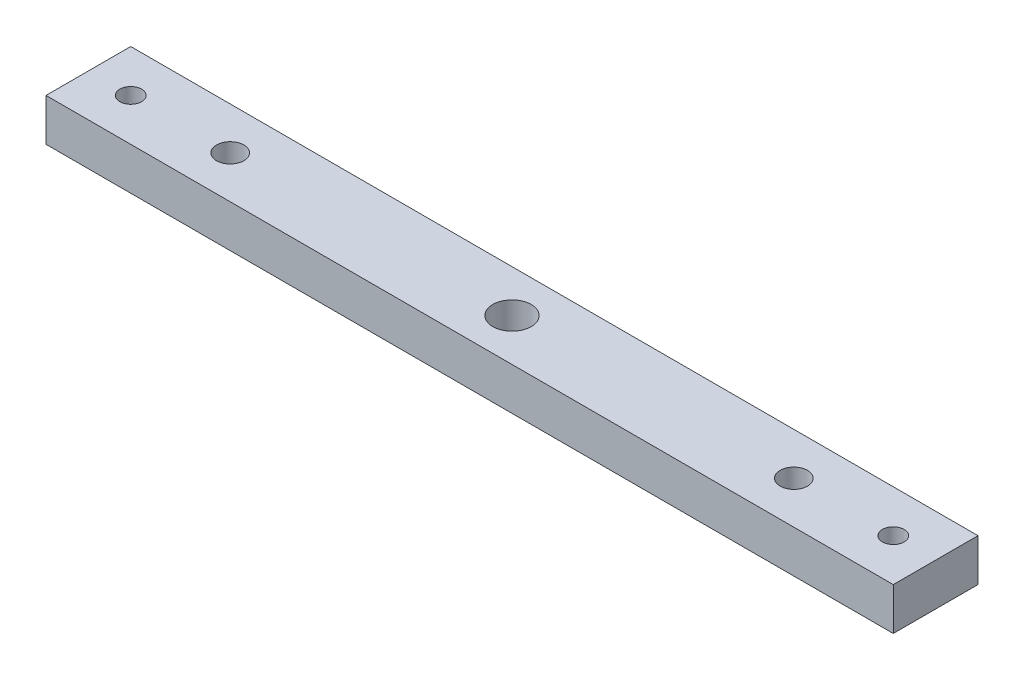
ISO-10303-21;
HEADER;
FILE_DESCRIPTION(('STEP AP214'),'2;1');
FILE_NAME('part.step','',(''),(''),'','','');
FILE_SCHEMA(('AUTOMOTIVE_DESIGN { 1 0 10303 214 1 1 1 1 }'));
ENDSEC;
DATA;
#1=APPLICATION_CONTEXT('core data for automotive mechanical design processes');
#2=APPLICATION_PROTOCOL_DEFINITION('international standard','automotive_design',2000,#1);
#3=PRODUCT_CONTEXT('',#1,'mechanical');
#4=PRODUCT('Part','Part','',(#3));
#5=PRODUCT_RELATED_PRODUCT_CATEGORY('part','',(#4));
#6=PRODUCT_DEFINITION_FORMATION('','',#4);
#7=PRODUCT_DEFINITION_CONTEXT('part definition',#1,'design');
#8=PRODUCT_DEFINITION('design','',#6,#7);
#9=PRODUCT_DEFINITION_SHAPE('','',#8);
#10=(LENGTH_UNIT() NAMED_UNIT(*) SI_UNIT(.MILLI.,.METRE.));
#11=(NAMED_UNIT(*) PLANE_ANGLE_UNIT() SI_UNIT($,.RADIAN.));
#12=(NAMED_UNIT(*) SI_UNIT($,.STERADIAN.) SOLID_ANGLE_UNIT());
#13=UNCERTAINTY_MEASURE_WITH_UNIT(LENGTH_MEASURE(1.E-05),#10,'distance_accuracy_value','');
#14=(GEOMETRIC_REPRESENTATION_CONTEXT(3) GLOBAL_UNCERTAINTY_ASSIGNED_CONTEXT((#13)) GLOBAL_UNIT_ASSIGNED_CONTEXT((#10,
#11,#12)) REPRESENTATION_CONTEXT('',''));
#15=CARTESIAN_POINT('',(0.,0.,0.));
#16=DIRECTION('',(0.,0.,1.));
#17=DIRECTION('',(1.,0.,0.));
#18=AXIS2_PLACEMENT_3D('',#15,#16,#17);
#19=CARTESIAN_POINT('',(0.,12.7,0.));
#20=DIRECTION('',(-1.,0.,0.));
#21=DIRECTION('',(0.,0.,1.));
#22=AXIS2_PLACEMENT_3D('',#19,#20,#21);
#23=PLANE('',#22);
#24=DIRECTION('',(0.,0.,-1.));
#25=VECTOR('',#24,1.);
#26=CARTESIAN_POINT('',(0.,0.,0.));
#27=LINE('',#26,#25);
#28=CARTESIAN_POINT('',(0.,0.,0.));
#29=VERTEX_POINT('',#28);
#30=CARTESIAN_POINT('',(0.,0.,-25.4));
#31=VERTEX_POINT('',#30);
#32=EDGE_CURVE('E103',#29,#31,#27,.T.);
#33=ORIENTED_EDGE('',*,*,#32,.T.);
#34=DIRECTION('',(0.,-1.,0.));
#35=VECTOR('',#34,1.);
#36=CARTESIAN_POINT('',(0.,12.7,-25.4));
#37=LINE('',#36,#35);
#38=CARTESIAN_POINT('',(0.,12.7,-25.4));
#39=VERTEX_POINT('',#38);
#40=EDGE_CURVE('E12',#39,#31,#37,.T.);
#41=ORIENTED_EDGE('',*,*,#40,.F.);
#42=DIRECTION('',(0.,0.,-1.));
#43=VECTOR('',#42,1.);
#44=CARTESIAN_POINT('',(0.,12.7,0.));
#45=LINE('',#44,#43);
#46=CARTESIAN_POINT('',(0.,12.7,0.));
#47=VERTEX_POINT('',#46);
#48=EDGE_CURVE('E91',#47,#39,#45,.T.);
#49=ORIENTED_EDGE('',*,*,#48,.F.);
#50=DIRECTION('',(0.,-1.,0.));
#51=VECTOR('',#50,1.);
#52=CARTESIAN_POINT('',(0.,12.7,0.));
#53=LINE('',#52,#51);
#54=EDGE_CURVE('E99',#47,#29,#53,.T.);
#55=ORIENTED_EDGE('',*,*,#54,.T.);
#56=EDGE_LOOP('',(#33,#41,#49,#55));
#57=FACE_BOUND('',#56,.T.);
#58=ADVANCED_FACE('F39',(#57),#23,.F.);
#59=CARTESIAN_POINT('',(0.,12.7,-25.4));
#60=DIRECTION('',(0.,0.,1.));
#61=DIRECTION('',(1.,0.,0.));
#62=AXIS2_PLACEMENT_3D('',#59,#60,#61);
#63=PLANE('',#62);
#64=DIRECTION('',(-1.,0.,0.));
#65=VECTOR('',#64,1.);
#66=CARTESIAN_POINT('',(0.,0.,-25.4));
#67=LINE('',#66,#65);
#68=CARTESIAN_POINT('',(-254.,0.,-25.4));
#69=VERTEX_POINT('',#68);
#70=EDGE_CURVE('E95',#31,#69,#67,.T.);
#71=ORIENTED_EDGE('',*,*,#70,.T.);
#72=DIRECTION('',(0.,-1.,0.));
#73=VECTOR('',#72,1.);
#74=CARTESIAN_POINT('',(-254.,12.7,-25.4));
#75=LINE('',#74,#73);
#76=CARTESIAN_POINT('',(-254.,12.7,-25.4));
#77=VERTEX_POINT('',#76);
#78=EDGE_CURVE('E48',#77,#69,#75,.T.);
#79=ORIENTED_EDGE('',*,*,#78,.F.);
#80=DIRECTION('',(-1.,0.,0.));
#81=VECTOR('',#80,1.);
#82=CARTESIAN_POINT('',(0.,12.7,-25.4));
#83=LINE('',#82,#81);
#84=EDGE_CURVE('E86',#39,#77,#83,.T.);
#85=ORIENTED_EDGE('',*,*,#84,.F.);
#86=ORIENTED_EDGE('',*,*,#40,.T.);
#87=EDGE_LOOP('',(#71,#79,#85,#86));
#88=FACE_BOUND('',#87,.T.);
#89=ADVANCED_FACE('F94',(#88),#63,.F.);
#90=CARTESIAN_POINT('',(-254.,12.7,0.));
#91=DIRECTION('',(1.,0.,0.));
#92=DIRECTION('',(0.,0.,-1.));
#93=AXIS2_PLACEMENT_3D('',#90,#91,#92);
#94=PLANE('',#93);
#95=DIRECTION('',(0.,0.,1.));
#96=VECTOR('',#95,1.);
#97=CARTESIAN_POINT('',(-254.,0.,0.));
#98=LINE('',#97,#96);
#99=CARTESIAN_POINT('',(-254.,0.,0.));
#100=VERTEX_POINT('',#99);
#101=EDGE_CURVE('E73',#69,#100,#98,.T.);
#102=ORIENTED_EDGE('',*,*,#101,.T.);
#103=DIRECTION('',(0.,-1.,0.));
#104=VECTOR('',#103,1.);
#105=CARTESIAN_POINT('',(-254.,12.7,0.));
#106=LINE('',#105,#104);
#107=CARTESIAN_POINT('',(-254.,12.7,0.));
#108=VERTEX_POINT('',#107);
#109=EDGE_CURVE('E96',#108,#100,#106,.T.);
#110=ORIENTED_EDGE('',*,*,#109,.F.);
#111=DIRECTION('',(0.,0.,1.));
#112=VECTOR('',#111,1.);
#113=CARTESIAN_POINT('',(-254.,12.7,0.));
#114=LINE('',#113,#112);
#115=EDGE_CURVE('E89',#77,#108,#114,.T.);
#116=ORIENTED_EDGE('',*,*,#115,.F.);
#117=ORIENTED_EDGE('',*,*,#78,.T.);
#118=EDGE_LOOP('',(#102,#110,#116,#117));
#119=FACE_BOUND('',#118,.T.);
#120=ADVANCED_FACE('F97',(#119),#94,.F.);
#121=CARTESIAN_POINT('',(0.,12.7,0.));
#122=DIRECTION('',(0.,0.,-1.));
#123=DIRECTION('',(-1.,0.,0.));
#124=AXIS2_PLACEMENT_3D('',#121,#122,#123);
#125=PLANE('',#124);
#126=DIRECTION('',(1.,0.,0.));
#127=VECTOR('',#126,1.);
#128=CARTESIAN_POINT('',(0.,0.,0.));
#129=LINE('',#128,#127);
#130=EDGE_CURVE('E79',#100,#29,#129,.T.);
#131=ORIENTED_EDGE('',*,*,#130,.T.);
#132=ORIENTED_EDGE('',*,*,#54,.F.);
#133=DIRECTION('',(1.,0.,0.));
#134=VECTOR('',#133,1.);
#135=CARTESIAN_POINT('',(0.,12.7,0.));
#136=LINE('',#135,#134);
#137=EDGE_CURVE('E56',#108,#47,#136,.T.);
#138=ORIENTED_EDGE('',*,*,#137,.F.);
#139=ORIENTED_EDGE('',*,*,#109,.T.);
#140=EDGE_LOOP('',(#131,#132,#138,#139));
#141=FACE_BOUND('',#140,.T.);
#142=ADVANCED_FACE('F122',(#141),#125,.F.);
#143=CARTESIAN_POINT('',(0.,12.7,0.));
#144=DIRECTION('',(0.,1.,0.));
#145=DIRECTION('',(0.,0.,1.));
#146=AXIS2_PLACEMENT_3D('',#143,#144,#145);
#147=PLANE('',#146);
#148=CARTESIAN_POINT('',(-127.,12.7,-12.7));
#149=DIRECTION('',(0.,1.,0.));
#150=DIRECTION('',(0.,0.,1.));
#151=AXIS2_PLACEMENT_3D('',#148,#149,#150);
#152=CIRCLE('',#151,5.75436999999998);
#153=CARTESIAN_POINT('',(-127.,12.7,-6.94563000000002));
#154=VERTEX_POINT('',#153);
#155=EDGE_CURVE('E168',#154,#154,#152,.T.);
#156=ORIENTED_EDGE('',*,*,#155,.F.);
#157=EDGE_LOOP('',(#156));
#158=FACE_BOUND('',#157,.T.);
#159=CARTESIAN_POINT('',(-241.3,12.7,-12.7));
#160=DIRECTION('',(0.,-1.,0.));
#161=DIRECTION('',(0.,0.,-1.));
#162=AXIS2_PLACEMENT_3D('',#159,#160,#161);
#163=CIRCLE('',#162,3.26389999999999);
#164=CARTESIAN_POINT('',(-241.3,12.7,-15.9639));
#165=VERTEX_POINT('',#164);
#166=EDGE_CURVE('E154',#165,#165,#163,.T.);
#167=ORIENTED_EDGE('',*,*,#166,.T.);
#168=EDGE_LOOP('',(#167));
#169=FACE_BOUND('',#168,.T.);
#170=CARTESIAN_POINT('',(-12.7,12.7,-12.7));
#171=DIRECTION('',(0.,-1.,0.));
#172=DIRECTION('',(0.,0.,-1.));
#173=AXIS2_PLACEMENT_3D('',#170,#171,#172);
#174=CIRCLE('',#173,3.2639);
#175=CARTESIAN_POINT('',(-12.7,12.7,-15.9639));
#176=VERTEX_POINT('',#175);
#177=EDGE_CURVE('E140',#176,#176,#174,.T.);
#178=ORIENTED_EDGE('',*,*,#177,.T.);
#179=EDGE_LOOP('',(#178));
#180=FACE_BOUND('',#179,.T.);
#181=CARTESIAN_POINT('',(-42.5196,12.7,-12.7));
#182=DIRECTION('',(0.,-1.,0.));
#183=DIRECTION('',(0.,0.,-1.));
#184=AXIS2_PLACEMENT_3D('',#181,#182,#183);
#185=CIRCLE('',#184,4.1021);
#186=CARTESIAN_POINT('',(-42.5196,12.7,-16.8021));
#187=VERTEX_POINT('',#186);
#188=EDGE_CURVE('E132',#187,#187,#185,.T.);
#189=ORIENTED_EDGE('',*,*,#188,.T.);
#190=EDGE_LOOP('',(#189));
#191=FACE_BOUND('',#190,.T.);
#192=CARTESIAN_POINT('',(-211.4804,12.7,-12.7));
#193=DIRECTION('',(0.,-1.,0.));
#194=DIRECTION('',(0.,0.,-1.));
#195=AXIS2_PLACEMENT_3D('',#192,#193,#194);
#196=CIRCLE('',#195,4.10209999999999);
#197=CARTESIAN_POINT('',(-211.4804,12.7,-16.8021));
#198=VERTEX_POINT('',#197);
#199=EDGE_CURVE('E108',#198,#198,#196,.T.);
#200=ORIENTED_EDGE('',*,*,#199,.T.);
#201=EDGE_LOOP('',(#200));
#202=FACE_BOUND('',#201,.T.);
#203=ORIENTED_EDGE('',*,*,#48,.T.);
#204=ORIENTED_EDGE('',*,*,#84,.T.);
#205=ORIENTED_EDGE('',*,*,#115,.T.);
#206=ORIENTED_EDGE('',*,*,#137,.T.);
#207=EDGE_LOOP('',(#203,#204,#205,#206));
#208=FACE_BOUND('',#207,.T.);
#209=ADVANCED_FACE('F87',(#158,#169,#180,#191,#202,#208),#147,.T.);
#210=CARTESIAN_POINT('',(0.,0.,0.));
#211=DIRECTION('',(0.,1.,0.));
#212=DIRECTION('',(0.,0.,1.));
#213=AXIS2_PLACEMENT_3D('',#210,#211,#212);
#214=PLANE('',#213);
#215=CARTESIAN_POINT('',(-127.,0.,-12.7));
#216=DIRECTION('',(0.,1.,0.));
#217=DIRECTION('',(0.,0.,1.));
#218=AXIS2_PLACEMENT_3D('',#215,#216,#217);
#219=CIRCLE('',#218,5.75436999999999);
#220=CARTESIAN_POINT('',(-127.,0.,-6.94563));
#221=VERTEX_POINT('',#220);
#222=EDGE_CURVE('E164',#221,#221,#219,.T.);
#223=ORIENTED_EDGE('',*,*,#222,.T.);
#224=EDGE_LOOP('',(#223));
#225=FACE_BOUND('',#224,.T.);
#226=CARTESIAN_POINT('',(-241.3,0.,-12.7));
#227=DIRECTION('',(0.,-1.,0.));
#228=DIRECTION('',(0.,0.,-1.));
#229=AXIS2_PLACEMENT_3D('',#226,#227,#228);
#230=CIRCLE('',#229,6.4389);
#231=CARTESIAN_POINT('',(-241.3,0.,-19.1389));
#232=VERTEX_POINT('',#231);
#233=EDGE_CURVE('E161',#232,#232,#230,.T.);
#234=ORIENTED_EDGE('',*,*,#233,.F.);
#235=EDGE_LOOP('',(#234));
#236=FACE_BOUND('',#235,.T.);
#237=CARTESIAN_POINT('',(-12.7,0.,-12.7));
#238=DIRECTION('',(0.,-1.,0.));
#239=DIRECTION('',(0.,0.,-1.));
#240=AXIS2_PLACEMENT_3D('',#237,#238,#239);
#241=CIRCLE('',#240,6.4389);
#242=CARTESIAN_POINT('',(-12.7,0.,-19.1389));
#243=VERTEX_POINT('',#242);
#244=EDGE_CURVE('E151',#243,#243,#241,.T.);
#245=ORIENTED_EDGE('',*,*,#244,.F.);
#246=EDGE_LOOP('',(#245));
#247=FACE_BOUND('',#246,.T.);
#248=CARTESIAN_POINT('',(-42.5196,0.,-12.7));
#249=DIRECTION('',(0.,-1.,0.));
#250=DIRECTION('',(0.,0.,-1.));
#251=AXIS2_PLACEMENT_3D('',#248,#249,#250);
#252=CIRCLE('',#251,4.1021);
#253=CARTESIAN_POINT('',(-42.5196,0.,-16.8021));
#254=VERTEX_POINT('',#253);
#255=EDGE_CURVE('E136',#254,#254,#252,.T.);
#256=ORIENTED_EDGE('',*,*,#255,.F.);
#257=EDGE_LOOP('',(#256));
#258=FACE_BOUND('',#257,.T.);
#259=CARTESIAN_POINT('',(-211.4804,0.,-12.7));
#260=DIRECTION('',(0.,-1.,0.));
#261=DIRECTION('',(0.,0.,-1.));
#262=AXIS2_PLACEMENT_3D('',#259,#260,#261);
#263=CIRCLE('',#262,4.10209999999999);
#264=CARTESIAN_POINT('',(-211.4804,0.,-16.8021));
#265=VERTEX_POINT('',#264);
#266=EDGE_CURVE('E128',#265,#265,#263,.T.);
#267=ORIENTED_EDGE('',*,*,#266,.F.);
#268=EDGE_LOOP('',(#267));
#269=FACE_BOUND('',#268,.T.);
#270=ORIENTED_EDGE('',*,*,#32,.F.);
#271=ORIENTED_EDGE('',*,*,#130,.F.);
#272=ORIENTED_EDGE('',*,*,#101,.F.);
#273=ORIENTED_EDGE('',*,*,#70,.F.);
#274=EDGE_LOOP('',(#270,#271,#272,#273));
#275=FACE_BOUND('',#274,.T.);
#276=ADVANCED_FACE('F125',(#225,#236,#247,#258,#269,#275),#214,.F.);
#277=CARTESIAN_POINT('',(-211.4804,12.7,-12.7));
#278=DIRECTION('',(0.,-1.,0.));
#279=DIRECTION('',(0.,0.,-1.));
#280=AXIS2_PLACEMENT_3D('',#277,#278,#279);
#281=CYLINDRICAL_SURFACE('',#280,4.10209999999999);
#282=ORIENTED_EDGE('',*,*,#199,.F.);
#283=EDGE_LOOP('',(#282));
#284=FACE_BOUND('',#283,.T.);
#285=ORIENTED_EDGE('',*,*,#266,.T.);
#286=EDGE_LOOP('',(#285));
#287=FACE_BOUND('',#286,.T.);
#288=ADVANCED_FACE('F207',(#284,#287),#281,.F.);
#289=CARTESIAN_POINT('',(-42.5196,12.7,-12.7));
#290=DIRECTION('',(0.,-1.,0.));
#291=DIRECTION('',(0.,0.,-1.));
#292=AXIS2_PLACEMENT_3D('',#289,#290,#291);
#293=CYLINDRICAL_SURFACE('',#292,4.1021);
#294=ORIENTED_EDGE('',*,*,#188,.F.);
#295=EDGE_LOOP('',(#294));
#296=FACE_BOUND('',#295,.T.);
#297=ORIENTED_EDGE('',*,*,#255,.T.);
#298=EDGE_LOOP('',(#297));
#299=FACE_BOUND('',#298,.T.);
#300=ADVANCED_FACE('F212',(#296,#299),#293,.F.);
#301=CARTESIAN_POINT('',(-12.7,0.,-12.7));
#302=DIRECTION('',(0.,-1.,0.));
#303=DIRECTION('',(0.,0.,-1.));
#304=AXIS2_PLACEMENT_3D('',#301,#302,#303);
#305=CYLINDRICAL_SURFACE('',#304,3.2639);
#306=ORIENTED_EDGE('',*,*,#177,.F.);
#307=EDGE_LOOP('',(#306));
#308=FACE_BOUND('',#307,.T.);
#309=CARTESIAN_POINT('',(-12.7,3.6524196929267,-12.7));
#310=DIRECTION('',(0.,-1.,0.));
#311=DIRECTION('',(0.,0.,-1.));
#312=AXIS2_PLACEMENT_3D('',#309,#310,#311);
#313=CIRCLE('',#312,3.2639);
#314=CARTESIAN_POINT('',(-12.7,3.6524196929267,-15.9639));
#315=VERTEX_POINT('',#314);
#316=EDGE_CURVE('E147',#315,#315,#313,.T.);
#317=ORIENTED_EDGE('',*,*,#316,.T.);
#318=EDGE_LOOP('',(#317));
#319=FACE_BOUND('',#318,.T.);
#320=ADVANCED_FACE('F271',(#308,#319),#305,.F.);
#321=CARTESIAN_POINT('',(-12.7,0.,-12.7));
#322=DIRECTION('',(0.,-1.,0.));
#323=DIRECTION('',(0.,0.,-1.));
#324=AXIS2_PLACEMENT_3D('',#321,#322,#323);
#325=CONICAL_SURFACE('',#324,6.4389,0.715584993317676);
#326=ORIENTED_EDGE('',*,*,#316,.F.);
#327=EDGE_LOOP('',(#326));
#328=FACE_BOUND('',#327,.T.);
#329=ORIENTED_EDGE('',*,*,#244,.T.);
#330=EDGE_LOOP('',(#329));
#331=FACE_BOUND('',#330,.T.);
#332=ADVANCED_FACE('F275',(#328,#331),#325,.F.);
#333=CARTESIAN_POINT('',(-241.3,0.,-12.7));
#334=DIRECTION('',(0.,-1.,0.));
#335=DIRECTION('',(0.,0.,-1.));
#336=AXIS2_PLACEMENT_3D('',#333,#334,#335);
#337=CYLINDRICAL_SURFACE('',#336,3.26389999999999);
#338=ORIENTED_EDGE('',*,*,#166,.F.);
#339=EDGE_LOOP('',(#338));
#340=FACE_BOUND('',#339,.T.);
#341=CARTESIAN_POINT('',(-241.3,3.6524196929267,-12.7));
#342=DIRECTION('',(0.,-1.,0.));
#343=DIRECTION('',(0.,0.,-1.));
#344=AXIS2_PLACEMENT_3D('',#341,#342,#343);
#345=CIRCLE('',#344,3.26389999999999);
#346=CARTESIAN_POINT('',(-241.3,3.6524196929267,-15.9639));
#347=VERTEX_POINT('',#346);
#348=EDGE_CURVE('E157',#347,#347,#345,.T.);
#349=ORIENTED_EDGE('',*,*,#348,.T.);
#350=EDGE_LOOP('',(#349));
#351=FACE_BOUND('',#350,.T.);
#352=ADVANCED_FACE('F281',(#340,#351),#337,.F.);
#353=CARTESIAN_POINT('',(-241.3,0.,-12.7));
#354=DIRECTION('',(0.,-1.,0.));
#355=DIRECTION('',(0.,0.,-1.));
#356=AXIS2_PLACEMENT_3D('',#353,#354,#355);
#357=CONICAL_SURFACE('',#356,6.4389,0.715584993317677);
#358=ORIENTED_EDGE('',*,*,#348,.F.);
#359=EDGE_LOOP('',(#358));
#360=FACE_BOUND('',#359,.T.);
#361=ORIENTED_EDGE('',*,*,#233,.T.);
#362=EDGE_LOOP('',(#361));
#363=FACE_BOUND('',#362,.T.);
#364=ADVANCED_FACE('F285',(#360,#363),#357,.F.);
#365=CARTESIAN_POINT('',(-127.,12.7,-12.7));
#366=DIRECTION('',(0.,1.,0.));
#367=DIRECTION('',(0.,0.,1.));
#368=AXIS2_PLACEMENT_3D('',#365,#366,#367);
#369=CYLINDRICAL_SURFACE('',#368,5.75436999999999);
#370=ORIENTED_EDGE('',*,*,#222,.F.);
#371=EDGE_LOOP('',(#370));
#372=FACE_BOUND('',#371,.T.);
#373=ORIENTED_EDGE('',*,*,#155,.T.);
#374=EDGE_LOOP('',(#373));
#375=FACE_BOUND('',#374,.T.);
#376=ADVANCED_FACE('F176',(#372,#375),#369,.F.);
#377=CLOSED_SHELL('',(#58,#89,#120,#142,#209,#276,#288,#300,#320,#332,#352,#364,#376));
#378=MANIFOLD_SOLID_BREP('B2',#377);
#379=ADVANCED_BREP_SHAPE_REPRESENTATION('',(#18,#378),#14);
#380=SHAPE_DEFINITION_REPRESENTATION(#9,#379);
ENDSEC;
END-ISO-10303-21;
